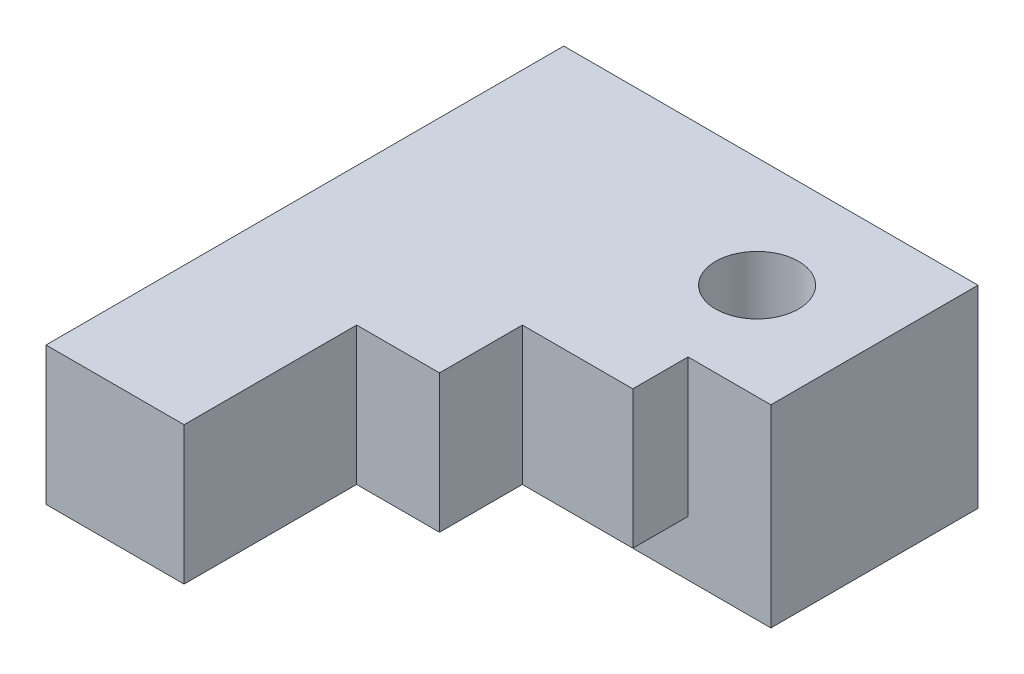
ISO-10303-21;
HEADER;
FILE_DESCRIPTION(('STEP AP214'),'2;1');
FILE_NAME('part.step','',(''),(''),'','','');
FILE_SCHEMA(('AUTOMOTIVE_DESIGN { 1 0 10303 214 1 1 1 1 }'));
ENDSEC;
DATA;
#1=APPLICATION_CONTEXT('core data for automotive mechanical design processes');
#2=APPLICATION_PROTOCOL_DEFINITION('international standard','automotive_design',2000,#1);
#3=PRODUCT_CONTEXT('',#1,'mechanical');
#4=PRODUCT('Part','Part','',(#3));
#5=PRODUCT_RELATED_PRODUCT_CATEGORY('part','',(#4));
#6=PRODUCT_DEFINITION_FORMATION('','',#4);
#7=PRODUCT_DEFINITION_CONTEXT('part definition',#1,'design');
#8=PRODUCT_DEFINITION('design','',#6,#7);
#9=PRODUCT_DEFINITION_SHAPE('','',#8);
#10=(LENGTH_UNIT() NAMED_UNIT(*) SI_UNIT(.MILLI.,.METRE.));
#11=(NAMED_UNIT(*) PLANE_ANGLE_UNIT() SI_UNIT($,.RADIAN.));
#12=(NAMED_UNIT(*) SI_UNIT($,.STERADIAN.) SOLID_ANGLE_UNIT());
#13=UNCERTAINTY_MEASURE_WITH_UNIT(LENGTH_MEASURE(1.E-05),#10,'distance_accuracy_value','');
#14=(GEOMETRIC_REPRESENTATION_CONTEXT(3) GLOBAL_UNCERTAINTY_ASSIGNED_CONTEXT((#13)) GLOBAL_UNIT_ASSIGNED_CONTEXT((#10,
#11,#12)) REPRESENTATION_CONTEXT('',''));
#15=CARTESIAN_POINT('',(0.,0.,0.));
#16=DIRECTION('',(0.,0.,1.));
#17=DIRECTION('',(1.,0.,0.));
#18=AXIS2_PLACEMENT_3D('',#15,#16,#17);
#19=CARTESIAN_POINT('',(0.,0.,30.));
#20=DIRECTION('',(1.,0.,0.));
#21=DIRECTION('',(0.,1.,0.));
#22=AXIS2_PLACEMENT_3D('',#19,#20,#21);
#23=PLANE('',#22);
#24=DIRECTION('',(0.,-1.,0.));
#25=VECTOR('',#24,1.);
#26=CARTESIAN_POINT('',(0.,0.,0.));
#27=LINE('',#26,#25);
#28=CARTESIAN_POINT('',(0.,0.,0.));
#29=VERTEX_POINT('',#28);
#30=CARTESIAN_POINT('',(0.,-28.,0.));
#31=VERTEX_POINT('',#30);
#32=EDGE_CURVE('E186',#29,#31,#27,.T.);
#33=ORIENTED_EDGE('',*,*,#32,.T.);
#34=DIRECTION('',(0.,0.,-1.));
#35=VECTOR('',#34,1.);
#36=CARTESIAN_POINT('',(0.,-28.,30.));
#37=LINE('',#36,#35);
#38=CARTESIAN_POINT('',(0.,-28.,30.));
#39=VERTEX_POINT('',#38);
#40=EDGE_CURVE('E11',#39,#31,#37,.T.);
#41=ORIENTED_EDGE('',*,*,#40,.F.);
#42=DIRECTION('',(0.,-1.,0.));
#43=VECTOR('',#42,1.);
#44=CARTESIAN_POINT('',(0.,0.,30.));
#45=LINE('',#44,#43);
#46=CARTESIAN_POINT('',(0.,-20.,30.));
#47=VERTEX_POINT('',#46);
#48=EDGE_CURVE('E191',#47,#39,#45,.T.);
#49=ORIENTED_EDGE('',*,*,#48,.F.);
#50=DIRECTION('',(0.,0.,-1.));
#51=VECTOR('',#50,1.);
#52=CARTESIAN_POINT('',(0.,-20.,75.));
#53=LINE('',#52,#51);
#54=CARTESIAN_POINT('',(0.,-20.,75.));
#55=VERTEX_POINT('',#54);
#56=EDGE_CURVE('E175',#55,#47,#53,.T.);
#57=ORIENTED_EDGE('',*,*,#56,.F.);
#58=DIRECTION('',(0.,-1.,0.));
#59=VECTOR('',#58,1.);
#60=CARTESIAN_POINT('',(0.,0.,75.));
#61=LINE('',#60,#59);
#62=CARTESIAN_POINT('',(0.,0.,75.));
#63=VERTEX_POINT('',#62);
#64=EDGE_CURVE('E173',#63,#55,#61,.T.);
#65=ORIENTED_EDGE('',*,*,#64,.F.);
#66=DIRECTION('',(0.,0.,-1.));
#67=VECTOR('',#66,1.);
#68=CARTESIAN_POINT('',(0.,0.,75.));
#69=LINE('',#68,#67);
#70=EDGE_CURVE('E177',#63,#29,#69,.T.);
#71=ORIENTED_EDGE('',*,*,#70,.T.);
#72=EDGE_LOOP('',(#33,#41,#49,#57,#65,#71));
#73=FACE_BOUND('',#72,.T.);
#74=ADVANCED_FACE('F43',(#73),#23,.F.);
#75=CARTESIAN_POINT('',(0.,-28.,30.));
#76=DIRECTION('',(0.,1.,0.));
#77=DIRECTION('',(0.,0.,1.));
#78=AXIS2_PLACEMENT_3D('',#75,#76,#77);
#79=PLANE('',#78);
#80=CARTESIAN_POINT('',(44.,-28.,16.));
#81=DIRECTION('',(0.,-1.,0.));
#82=DIRECTION('',(0.,0.,-1.));
#83=AXIS2_PLACEMENT_3D('',#80,#81,#82);
#84=CIRCLE('',#83,6.);
#85=CARTESIAN_POINT('',(44.,-28.,10.));
#86=VERTEX_POINT('',#85);
#87=EDGE_CURVE('E447',#86,#86,#84,.T.);
#88=ORIENTED_EDGE('',*,*,#87,.F.);
#89=EDGE_LOOP('',(#88));
#90=FACE_BOUND('',#89,.T.);
#91=DIRECTION('',(1.,0.,0.));
#92=VECTOR('',#91,1.);
#93=CARTESIAN_POINT('',(0.,-28.,0.));
#94=LINE('',#93,#92);
#95=CARTESIAN_POINT('',(60.,-28.,0.));
#96=VERTEX_POINT('',#95);
#97=EDGE_CURVE('E203',#31,#96,#94,.T.);
#98=ORIENTED_EDGE('',*,*,#97,.T.);
#99=DIRECTION('',(0.,0.,-1.));
#100=VECTOR('',#99,1.);
#101=CARTESIAN_POINT('',(60.,-28.,30.));
#102=LINE('',#101,#100);
#103=CARTESIAN_POINT('',(60.,-28.,30.));
#104=VERTEX_POINT('',#103);
#105=EDGE_CURVE('E50',#104,#96,#102,.T.);
#106=ORIENTED_EDGE('',*,*,#105,.F.);
#107=DIRECTION('',(1.,0.,0.));
#108=VECTOR('',#107,1.);
#109=CARTESIAN_POINT('',(0.,-28.,30.));
#110=LINE('',#109,#108);
#111=EDGE_CURVE('E193',#39,#104,#110,.T.);
#112=ORIENTED_EDGE('',*,*,#111,.F.);
#113=ORIENTED_EDGE('',*,*,#40,.T.);
#114=EDGE_LOOP('',(#98,#106,#112,#113));
#115=FACE_BOUND('',#114,.T.);
#116=ADVANCED_FACE('F219',(#90,#115),#79,.F.);
#117=CARTESIAN_POINT('',(60.,0.,30.));
#118=DIRECTION('',(1.,0.,0.));
#119=DIRECTION('',(0.,0.,-1.));
#120=AXIS2_PLACEMENT_3D('',#117,#118,#119);
#121=PLANE('',#120);
#122=DIRECTION('',(0.,-1.,0.));
#123=VECTOR('',#122,1.);
#124=CARTESIAN_POINT('',(60.,0.,0.));
#125=LINE('',#124,#123);
#126=CARTESIAN_POINT('',(60.,0.,0.));
#127=VERTEX_POINT('',#126);
#128=EDGE_CURVE('E206',#127,#96,#125,.T.);
#129=ORIENTED_EDGE('',*,*,#128,.F.);
#130=DIRECTION('',(0.,0.,-1.));
#131=VECTOR('',#130,1.);
#132=CARTESIAN_POINT('',(60.,0.,30.));
#133=LINE('',#132,#131);
#134=CARTESIAN_POINT('',(60.,0.,30.));
#135=VERTEX_POINT('',#134);
#136=EDGE_CURVE('E201',#135,#127,#133,.T.);
#137=ORIENTED_EDGE('',*,*,#136,.F.);
#138=DIRECTION('',(0.,-1.,0.));
#139=VECTOR('',#138,1.);
#140=CARTESIAN_POINT('',(60.,0.,30.));
#141=LINE('',#140,#139);
#142=EDGE_CURVE('E195',#135,#104,#141,.T.);
#143=ORIENTED_EDGE('',*,*,#142,.T.);
#144=ORIENTED_EDGE('',*,*,#105,.T.);
#145=EDGE_LOOP('',(#129,#137,#143,#144));
#146=FACE_BOUND('',#145,.T.);
#147=ADVANCED_FACE('F214',(#146),#121,.T.);
#148=CARTESIAN_POINT('',(0.,0.,30.));
#149=DIRECTION('',(0.,1.,0.));
#150=DIRECTION('',(0.,0.,1.));
#151=AXIS2_PLACEMENT_3D('',#148,#149,#150);
#152=PLANE('',#151);
#153=CARTESIAN_POINT('',(44.,0.,16.));
#154=DIRECTION('',(0.,-1.,0.));
#155=DIRECTION('',(0.,0.,-1.));
#156=AXIS2_PLACEMENT_3D('',#153,#154,#155);
#157=CIRCLE('',#156,6.);
#158=CARTESIAN_POINT('',(44.,0.,10.));
#159=VERTEX_POINT('',#158);
#160=EDGE_CURVE('E445',#159,#159,#157,.T.);
#161=ORIENTED_EDGE('',*,*,#160,.T.);
#162=EDGE_LOOP('',(#161));
#163=FACE_BOUND('',#162,.T.);
#164=DIRECTION('',(1.,0.,0.));
#165=VECTOR('',#164,1.);
#166=CARTESIAN_POINT('',(0.,0.,0.));
#167=LINE('',#166,#165);
#168=EDGE_CURVE('E189',#29,#127,#167,.T.);
#169=ORIENTED_EDGE('',*,*,#168,.F.);
#170=ORIENTED_EDGE('',*,*,#70,.F.);
#171=DIRECTION('',(1.,0.,0.));
#172=VECTOR('',#171,1.);
#173=CARTESIAN_POINT('',(0.,0.,75.));
#174=LINE('',#173,#172);
#175=CARTESIAN_POINT('',(20.,0.,75.));
#176=VERTEX_POINT('',#175);
#177=EDGE_CURVE('E170',#63,#176,#174,.T.);
#178=ORIENTED_EDGE('',*,*,#177,.T.);
#179=DIRECTION('',(0.,0.,-1.));
#180=VECTOR('',#179,1.);
#181=CARTESIAN_POINT('',(20.,0.,75.));
#182=LINE('',#181,#180);
#183=CARTESIAN_POINT('',(20.,0.,50.));
#184=VERTEX_POINT('',#183);
#185=EDGE_CURVE('E180',#176,#184,#182,.T.);
#186=ORIENTED_EDGE('',*,*,#185,.T.);
#187=DIRECTION('',(1.,0.,0.));
#188=VECTOR('',#187,1.);
#189=CARTESIAN_POINT('',(0.,0.,50.));
#190=LINE('',#189,#188);
#191=CARTESIAN_POINT('',(32.,0.,50.));
#192=VERTEX_POINT('',#191);
#193=EDGE_CURVE('E156',#184,#192,#190,.T.);
#194=ORIENTED_EDGE('',*,*,#193,.T.);
#195=DIRECTION('',(0.,0.,-1.));
#196=VECTOR('',#195,1.);
#197=CARTESIAN_POINT('',(32.,0.,50.));
#198=LINE('',#197,#196);
#199=CARTESIAN_POINT('',(32.,0.,38.));
#200=VERTEX_POINT('',#199);
#201=EDGE_CURVE('E162',#192,#200,#198,.T.);
#202=ORIENTED_EDGE('',*,*,#201,.T.);
#203=DIRECTION('',(1.,0.,0.));
#204=VECTOR('',#203,1.);
#205=CARTESIAN_POINT('',(0.,0.,38.));
#206=LINE('',#205,#204);
#207=CARTESIAN_POINT('',(48.,0.,38.));
#208=VERTEX_POINT('',#207);
#209=EDGE_CURVE('E146',#200,#208,#206,.T.);
#210=ORIENTED_EDGE('',*,*,#209,.T.);
#211=DIRECTION('',(0.,0.,-1.));
#212=VECTOR('',#211,1.);
#213=CARTESIAN_POINT('',(48.,0.,38.));
#214=LINE('',#213,#212);
#215=CARTESIAN_POINT('',(48.,0.,30.));
#216=VERTEX_POINT('',#215);
#217=EDGE_CURVE('E141',#208,#216,#214,.T.);
#218=ORIENTED_EDGE('',*,*,#217,.T.);
#219=DIRECTION('',(1.,0.,0.));
#220=VECTOR('',#219,1.);
#221=CARTESIAN_POINT('',(0.,0.,30.));
#222=LINE('',#221,#220);
#223=EDGE_CURVE('E198',#216,#135,#222,.T.);
#224=ORIENTED_EDGE('',*,*,#223,.T.);
#225=ORIENTED_EDGE('',*,*,#136,.T.);
#226=EDGE_LOOP('',(#169,#170,#178,#186,#194,#202,#210,#218,#224,#225));
#227=FACE_BOUND('',#226,.T.);
#228=ADVANCED_FACE('F225',(#163,#227),#152,.T.);
#229=CARTESIAN_POINT('',(0.,0.,30.));
#230=DIRECTION('',(0.,0.,1.));
#231=DIRECTION('',(1.,0.,0.));
#232=AXIS2_PLACEMENT_3D('',#229,#230,#231);
#233=PLANE('',#232);
#234=DIRECTION('',(0.,1.,0.));
#235=VECTOR('',#234,1.);
#236=CARTESIAN_POINT('',(48.,0.,30.));
#237=LINE('',#236,#235);
#238=CARTESIAN_POINT('',(48.,-20.,30.));
#239=VERTEX_POINT('',#238);
#240=EDGE_CURVE('E187',#239,#216,#237,.T.);
#241=ORIENTED_EDGE('',*,*,#240,.F.);
#242=DIRECTION('',(1.,0.,0.));
#243=VECTOR('',#242,1.);
#244=CARTESIAN_POINT('',(0.,-20.,30.));
#245=LINE('',#244,#243);
#246=EDGE_CURVE('E136',#47,#239,#245,.T.);
#247=ORIENTED_EDGE('',*,*,#246,.F.);
#248=ORIENTED_EDGE('',*,*,#48,.T.);
#249=ORIENTED_EDGE('',*,*,#111,.T.);
#250=ORIENTED_EDGE('',*,*,#142,.F.);
#251=ORIENTED_EDGE('',*,*,#223,.F.);
#252=EDGE_LOOP('',(#241,#247,#248,#249,#250,#251));
#253=FACE_BOUND('',#252,.T.);
#254=ADVANCED_FACE('F228',(#253),#233,.T.);
#255=CARTESIAN_POINT('',(0.,0.,0.));
#256=DIRECTION('',(0.,0.,1.));
#257=DIRECTION('',(1.,0.,0.));
#258=AXIS2_PLACEMENT_3D('',#255,#256,#257);
#259=PLANE('',#258);
#260=ORIENTED_EDGE('',*,*,#32,.F.);
#261=ORIENTED_EDGE('',*,*,#168,.T.);
#262=ORIENTED_EDGE('',*,*,#128,.T.);
#263=ORIENTED_EDGE('',*,*,#97,.F.);
#264=EDGE_LOOP('',(#260,#261,#262,#263));
#265=FACE_BOUND('',#264,.T.);
#266=ADVANCED_FACE('F223',(#265),#259,.F.);
#267=CARTESIAN_POINT('',(0.,-20.,75.));
#268=DIRECTION('',(0.,1.,0.));
#269=DIRECTION('',(0.,0.,1.));
#270=AXIS2_PLACEMENT_3D('',#267,#268,#269);
#271=PLANE('',#270);
#272=ORIENTED_EDGE('',*,*,#246,.T.);
#273=DIRECTION('',(0.,0.,-1.));
#274=VECTOR('',#273,1.);
#275=CARTESIAN_POINT('',(48.,-20.,38.));
#276=LINE('',#275,#274);
#277=CARTESIAN_POINT('',(48.,-20.,38.));
#278=VERTEX_POINT('',#277);
#279=EDGE_CURVE('E133',#278,#239,#276,.T.);
#280=ORIENTED_EDGE('',*,*,#279,.F.);
#281=DIRECTION('',(1.,0.,0.));
#282=VECTOR('',#281,1.);
#283=CARTESIAN_POINT('',(0.,-20.,38.));
#284=LINE('',#283,#282);
#285=CARTESIAN_POINT('',(32.,-20.,38.));
#286=VERTEX_POINT('',#285);
#287=EDGE_CURVE('E123',#286,#278,#284,.T.);
#288=ORIENTED_EDGE('',*,*,#287,.F.);
#289=DIRECTION('',(0.,0.,-1.));
#290=VECTOR('',#289,1.);
#291=CARTESIAN_POINT('',(32.,-20.,50.));
#292=LINE('',#291,#290);
#293=CARTESIAN_POINT('',(32.,-20.,50.));
#294=VERTEX_POINT('',#293);
#295=EDGE_CURVE('E57',#294,#286,#292,.T.);
#296=ORIENTED_EDGE('',*,*,#295,.F.);
#297=DIRECTION('',(1.,0.,0.));
#298=VECTOR('',#297,1.);
#299=CARTESIAN_POINT('',(0.,-20.,50.));
#300=LINE('',#299,#298);
#301=CARTESIAN_POINT('',(20.,-20.,50.));
#302=VERTEX_POINT('',#301);
#303=EDGE_CURVE('E140',#302,#294,#300,.T.);
#304=ORIENTED_EDGE('',*,*,#303,.F.);
#305=DIRECTION('',(0.,0.,-1.));
#306=VECTOR('',#305,1.);
#307=CARTESIAN_POINT('',(20.,-20.,75.));
#308=LINE('',#307,#306);
#309=CARTESIAN_POINT('',(20.,-20.,75.));
#310=VERTEX_POINT('',#309);
#311=EDGE_CURVE('E183',#310,#302,#308,.T.);
#312=ORIENTED_EDGE('',*,*,#311,.F.);
#313=DIRECTION('',(1.,0.,0.));
#314=VECTOR('',#313,1.);
#315=CARTESIAN_POINT('',(0.,-20.,75.));
#316=LINE('',#315,#314);
#317=EDGE_CURVE('E165',#55,#310,#316,.T.);
#318=ORIENTED_EDGE('',*,*,#317,.F.);
#319=ORIENTED_EDGE('',*,*,#56,.T.);
#320=EDGE_LOOP('',(#272,#280,#288,#296,#304,#312,#318,#319));
#321=FACE_BOUND('',#320,.T.);
#322=ADVANCED_FACE('F134',(#321),#271,.F.);
#323=CARTESIAN_POINT('',(20.,0.,75.));
#324=DIRECTION('',(-1.,0.,0.));
#325=DIRECTION('',(0.,0.,1.));
#326=AXIS2_PLACEMENT_3D('',#323,#324,#325);
#327=PLANE('',#326);
#328=ORIENTED_EDGE('',*,*,#311,.T.);
#329=DIRECTION('',(0.,1.,0.));
#330=VECTOR('',#329,1.);
#331=CARTESIAN_POINT('',(20.,0.,50.));
#332=LINE('',#331,#330);
#333=EDGE_CURVE('E159',#302,#184,#332,.T.);
#334=ORIENTED_EDGE('',*,*,#333,.T.);
#335=ORIENTED_EDGE('',*,*,#185,.F.);
#336=DIRECTION('',(0.,1.,0.));
#337=VECTOR('',#336,1.);
#338=CARTESIAN_POINT('',(20.,0.,75.));
#339=LINE('',#338,#337);
#340=EDGE_CURVE('E168',#310,#176,#339,.T.);
#341=ORIENTED_EDGE('',*,*,#340,.F.);
#342=EDGE_LOOP('',(#328,#334,#335,#341));
#343=FACE_BOUND('',#342,.T.);
#344=ADVANCED_FACE('F238',(#343),#327,.F.);
#345=CARTESIAN_POINT('',(0.,0.,75.));
#346=DIRECTION('',(0.,0.,1.));
#347=DIRECTION('',(1.,0.,0.));
#348=AXIS2_PLACEMENT_3D('',#345,#346,#347);
#349=PLANE('',#348);
#350=ORIENTED_EDGE('',*,*,#317,.T.);
#351=ORIENTED_EDGE('',*,*,#340,.T.);
#352=ORIENTED_EDGE('',*,*,#177,.F.);
#353=ORIENTED_EDGE('',*,*,#64,.T.);
#354=EDGE_LOOP('',(#350,#351,#352,#353));
#355=FACE_BOUND('',#354,.T.);
#356=ADVANCED_FACE('F235',(#355),#349,.T.);
#357=CARTESIAN_POINT('',(32.,0.,50.));
#358=DIRECTION('',(-1.,0.,0.));
#359=DIRECTION('',(0.,0.,1.));
#360=AXIS2_PLACEMENT_3D('',#357,#358,#359);
#361=PLANE('',#360);
#362=ORIENTED_EDGE('',*,*,#295,.T.);
#363=DIRECTION('',(0.,1.,0.));
#364=VECTOR('',#363,1.);
#365=CARTESIAN_POINT('',(32.,0.,38.));
#366=LINE('',#365,#364);
#367=EDGE_CURVE('E62',#286,#200,#366,.T.);
#368=ORIENTED_EDGE('',*,*,#367,.T.);
#369=ORIENTED_EDGE('',*,*,#201,.F.);
#370=DIRECTION('',(0.,1.,0.));
#371=VECTOR('',#370,1.);
#372=CARTESIAN_POINT('',(32.,0.,50.));
#373=LINE('',#372,#371);
#374=EDGE_CURVE('E154',#294,#192,#373,.T.);
#375=ORIENTED_EDGE('',*,*,#374,.F.);
#376=EDGE_LOOP('',(#362,#368,#369,#375));
#377=FACE_BOUND('',#376,.T.);
#378=ADVANCED_FACE('F243',(#377),#361,.F.);
#379=CARTESIAN_POINT('',(0.,0.,50.));
#380=DIRECTION('',(0.,0.,1.));
#381=DIRECTION('',(1.,0.,0.));
#382=AXIS2_PLACEMENT_3D('',#379,#380,#381);
#383=PLANE('',#382);
#384=ORIENTED_EDGE('',*,*,#303,.T.);
#385=ORIENTED_EDGE('',*,*,#374,.T.);
#386=ORIENTED_EDGE('',*,*,#193,.F.);
#387=ORIENTED_EDGE('',*,*,#333,.F.);
#388=EDGE_LOOP('',(#384,#385,#386,#387));
#389=FACE_BOUND('',#388,.T.);
#390=ADVANCED_FACE('F242',(#389),#383,.T.);
#391=CARTESIAN_POINT('',(48.,0.,38.));
#392=DIRECTION('',(-1.,0.,0.));
#393=DIRECTION('',(0.,0.,1.));
#394=AXIS2_PLACEMENT_3D('',#391,#392,#393);
#395=PLANE('',#394);
#396=ORIENTED_EDGE('',*,*,#240,.T.);
#397=ORIENTED_EDGE('',*,*,#217,.F.);
#398=DIRECTION('',(0.,1.,0.));
#399=VECTOR('',#398,1.);
#400=CARTESIAN_POINT('',(48.,0.,38.));
#401=LINE('',#400,#399);
#402=EDGE_CURVE('E128',#278,#208,#401,.T.);
#403=ORIENTED_EDGE('',*,*,#402,.F.);
#404=ORIENTED_EDGE('',*,*,#279,.T.);
#405=EDGE_LOOP('',(#396,#397,#403,#404));
#406=FACE_BOUND('',#405,.T.);
#407=ADVANCED_FACE('F143',(#406),#395,.F.);
#408=CARTESIAN_POINT('',(0.,0.,38.));
#409=DIRECTION('',(0.,0.,1.));
#410=DIRECTION('',(1.,0.,0.));
#411=AXIS2_PLACEMENT_3D('',#408,#409,#410);
#412=PLANE('',#411);
#413=ORIENTED_EDGE('',*,*,#367,.F.);
#414=ORIENTED_EDGE('',*,*,#287,.T.);
#415=ORIENTED_EDGE('',*,*,#402,.T.);
#416=ORIENTED_EDGE('',*,*,#209,.F.);
#417=EDGE_LOOP('',(#413,#414,#415,#416));
#418=FACE_BOUND('',#417,.T.);
#419=ADVANCED_FACE('F125',(#418),#412,.T.);
#420=CARTESIAN_POINT('',(44.,0.,16.));
#421=DIRECTION('',(0.,-1.,0.));
#422=DIRECTION('',(0.,0.,-1.));
#423=AXIS2_PLACEMENT_3D('',#420,#421,#422);
#424=CYLINDRICAL_SURFACE('',#423,6.);
#425=ORIENTED_EDGE('',*,*,#160,.F.);
#426=EDGE_LOOP('',(#425));
#427=FACE_BOUND('',#426,.T.);
#428=ORIENTED_EDGE('',*,*,#87,.T.);
#429=EDGE_LOOP('',(#428));
#430=FACE_BOUND('',#429,.T.);
#431=ADVANCED_FACE('F311',(#427,#430),#424,.F.);
#432=CLOSED_SHELL('',(#74,#116,#147,#228,#254,#266,#322,#344,#356,#378,#390,#407,#419,#431));
#433=MANIFOLD_SOLID_BREP('B2',#432);
#434=ADVANCED_BREP_SHAPE_REPRESENTATION('',(#18,#433),#14);
#435=SHAPE_DEFINITION_REPRESENTATION(#9,#434);
ENDSEC;
END-ISO-10303-21;
